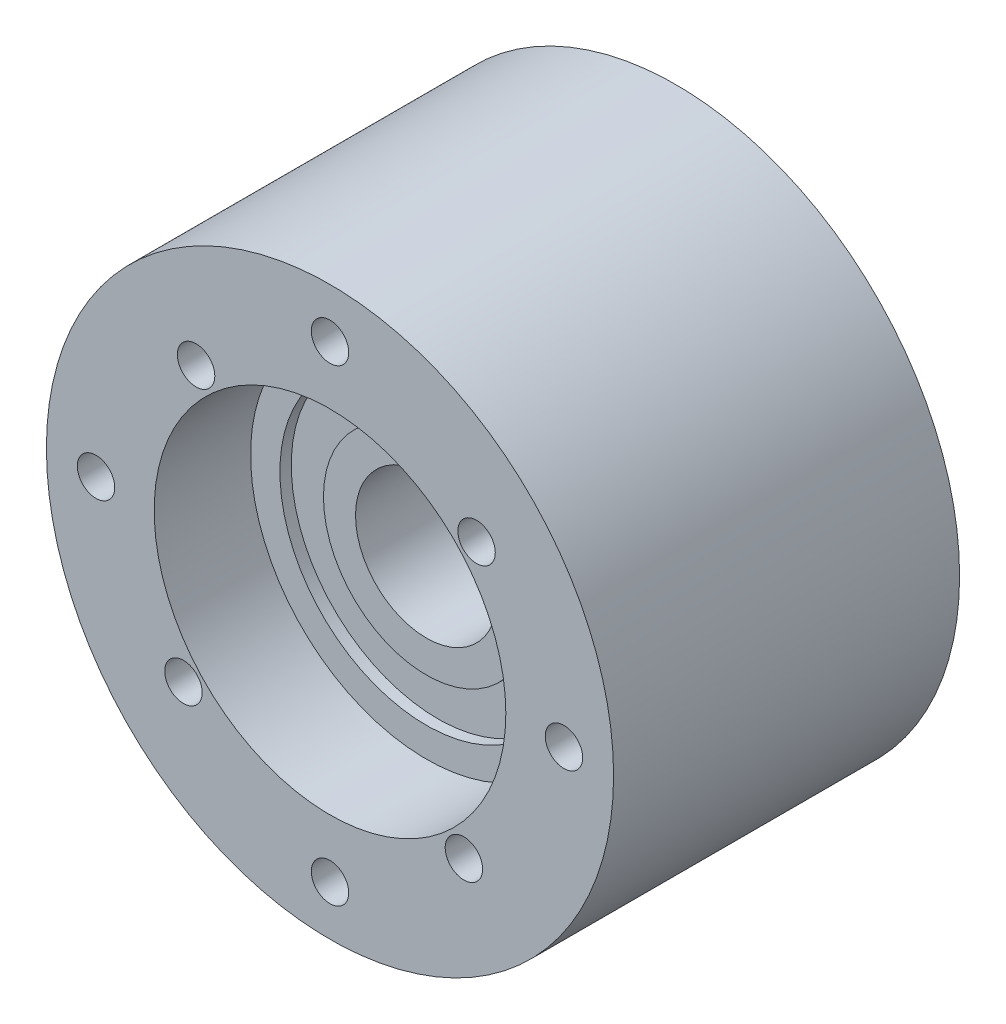
ISO-10303-21;
HEADER;
FILE_DESCRIPTION(('STEP AP214'),'2;1');
FILE_NAME('part.step','',(''),(''),'','','');
FILE_SCHEMA(('AUTOMOTIVE_DESIGN { 1 0 10303 214 1 1 1 1 }'));
ENDSEC;
DATA;
#1=APPLICATION_CONTEXT('core data for automotive mechanical design processes');
#2=APPLICATION_PROTOCOL_DEFINITION('international standard','automotive_design',2000,#1);
#3=PRODUCT_CONTEXT('',#1,'mechanical');
#4=PRODUCT('Part','Part','',(#3));
#5=PRODUCT_RELATED_PRODUCT_CATEGORY('part','',(#4));
#6=PRODUCT_DEFINITION_FORMATION('','',#4);
#7=PRODUCT_DEFINITION_CONTEXT('part definition',#1,'design');
#8=PRODUCT_DEFINITION('design','',#6,#7);
#9=PRODUCT_DEFINITION_SHAPE('','',#8);
#10=(LENGTH_UNIT() NAMED_UNIT(*) SI_UNIT(.MILLI.,.METRE.));
#11=(NAMED_UNIT(*) PLANE_ANGLE_UNIT() SI_UNIT($,.RADIAN.));
#12=(NAMED_UNIT(*) SI_UNIT($,.STERADIAN.) SOLID_ANGLE_UNIT());
#13=UNCERTAINTY_MEASURE_WITH_UNIT(LENGTH_MEASURE(1.E-05),#10,'distance_accuracy_value','');
#14=(GEOMETRIC_REPRESENTATION_CONTEXT(3) GLOBAL_UNCERTAINTY_ASSIGNED_CONTEXT((#13)) GLOBAL_UNIT_ASSIGNED_CONTEXT((#10,
#11,#12)) REPRESENTATION_CONTEXT('',''));
#15=CARTESIAN_POINT('',(0.,0.,0.));
#16=DIRECTION('',(0.,0.,1.));
#17=DIRECTION('',(1.,0.,0.));
#18=AXIS2_PLACEMENT_3D('',#15,#16,#17);
#19=CARTESIAN_POINT('',(0.,0.,44.));
#20=DIRECTION('',(0.,0.,1.));
#21=DIRECTION('',(1.,0.,0.));
#22=AXIS2_PLACEMENT_3D('',#19,#20,#21);
#23=PLANE('',#22);
#24=CARTESIAN_POINT('',(0.,0.,44.));
#25=DIRECTION('',(0.,0.,1.));
#26=DIRECTION('',(1.,0.,0.));
#27=AXIS2_PLACEMENT_3D('',#24,#25,#26);
#28=CIRCLE('',#27,12.5);
#29=CARTESIAN_POINT('',(12.5,0.,44.));
#30=VERTEX_POINT('',#29);
#31=EDGE_CURVE('E39',#30,#30,#28,.F.);
#32=ORIENTED_EDGE('',*,*,#31,.T.);
#33=EDGE_LOOP('',(#32));
#34=FACE_BOUND('',#33,.T.);
#35=CARTESIAN_POINT('',(0.,0.,44.));
#36=DIRECTION('',(0.,0.,1.));
#37=DIRECTION('',(1.,0.,0.));
#38=AXIS2_PLACEMENT_3D('',#35,#36,#37);
#39=CIRCLE('',#38,18.1537734431174);
#40=CARTESIAN_POINT('',(18.1537734431174,0.,44.));
#41=VERTEX_POINT('',#40);
#42=EDGE_CURVE('E91',#41,#41,#39,.T.);
#43=ORIENTED_EDGE('',*,*,#42,.T.);
#44=EDGE_LOOP('',(#43));
#45=FACE_BOUND('',#44,.T.);
#46=ADVANCED_FACE('F35',(#34,#45),#23,.T.);
#47=CARTESIAN_POINT('',(0.,0.,61.));
#48=DIRECTION('',(0.,0.,-1.));
#49=DIRECTION('',(-1.,0.,0.));
#50=AXIS2_PLACEMENT_3D('',#47,#48,#49);
#51=CYLINDRICAL_SURFACE('',#50,12.5);
#52=CARTESIAN_POINT('',(0.,0.,26.));
#53=DIRECTION('',(0.,0.,-1.));
#54=DIRECTION('',(-1.,0.,0.));
#55=AXIS2_PLACEMENT_3D('',#52,#53,#54);
#56=CIRCLE('',#55,12.5);
#57=CARTESIAN_POINT('',(-12.5,0.,26.));
#58=VERTEX_POINT('',#57);
#59=EDGE_CURVE('E157',#58,#58,#56,.T.);
#60=ORIENTED_EDGE('',*,*,#59,.T.);
#61=EDGE_LOOP('',(#60));
#62=FACE_BOUND('',#61,.T.);
#63=ORIENTED_EDGE('',*,*,#31,.F.);
#64=EDGE_LOOP('',(#63));
#65=FACE_BOUND('',#64,.T.);
#66=ADVANCED_FACE('F192',(#62,#65),#51,.F.);
#67=CARTESIAN_POINT('',(0.,0.,61.));
#68=DIRECTION('',(0.,0.,-1.));
#69=DIRECTION('',(-1.,0.,0.));
#70=AXIS2_PLACEMENT_3D('',#67,#68,#69);
#71=CYLINDRICAL_SURFACE('',#70,50.);
#72=CARTESIAN_POINT('',(0.,0.,61.));
#73=DIRECTION('',(0.,0.,1.));
#74=DIRECTION('',(1.,0.,0.));
#75=AXIS2_PLACEMENT_3D('',#72,#73,#74);
#76=CIRCLE('',#75,50.);
#77=CARTESIAN_POINT('',(-50.,0.,61.));
#78=VERTEX_POINT('',#77);
#79=EDGE_CURVE('E11',#78,#78,#76,.T.);
#80=CARTESIAN_POINT('',(0.,0.,0.));
#81=DIRECTION('',(0.,0.,1.));
#82=DIRECTION('',(1.,0.,0.));
#83=AXIS2_PLACEMENT_3D('',#80,#81,#82);
#84=CIRCLE('',#83,50.);
#85=CARTESIAN_POINT('',(-50.,0.,0.));
#86=VERTEX_POINT('',#85);
#87=EDGE_CURVE('E44',#86,#86,#84,.T.);
#88=CARTESIAN_POINT('',(-50.,0.,61.));
#89=CARTESIAN_POINT('',(-50.,0.,60.3645833333333));
#90=CARTESIAN_POINT('',(-50.,0.,59.7291666666667));
#91=CARTESIAN_POINT('',(-50.,0.,58.4583333333333));
#92=CARTESIAN_POINT('',(-50.,0.,57.8229166666667));
#93=CARTESIAN_POINT('',(-50.,0.,56.5520833333333));
#94=CARTESIAN_POINT('',(-50.,0.,55.9166666666667));
#95=CARTESIAN_POINT('',(-50.,0.,54.6458333333333));
#96=CARTESIAN_POINT('',(-50.,0.,54.0104166666667));
#97=CARTESIAN_POINT('',(-50.,0.,52.7395833333333));
#98=CARTESIAN_POINT('',(-50.,0.,52.1041666666667));
#99=CARTESIAN_POINT('',(-50.,0.,50.8333333333333));
#100=CARTESIAN_POINT('',(-50.,0.,50.1979166666667));
#101=CARTESIAN_POINT('',(-50.,0.,48.9270833333333));
#102=CARTESIAN_POINT('',(-50.,0.,48.2916666666667));
#103=CARTESIAN_POINT('',(-50.,0.,47.0208333333333));
#104=CARTESIAN_POINT('',(-50.,0.,46.3854166666667));
#105=CARTESIAN_POINT('',(-50.,0.,45.1145833333333));
#106=CARTESIAN_POINT('',(-50.,0.,44.4791666666667));
#107=CARTESIAN_POINT('',(-50.,0.,43.2083333333333));
#108=CARTESIAN_POINT('',(-50.,0.,42.5729166666667));
#109=CARTESIAN_POINT('',(-50.,0.,41.3020833333333));
#110=CARTESIAN_POINT('',(-50.,0.,40.6666666666667));
#111=CARTESIAN_POINT('',(-50.,0.,39.3958333333333));
#112=CARTESIAN_POINT('',(-50.,0.,38.7604166666667));
#113=CARTESIAN_POINT('',(-50.,0.,37.4895833333333));
#114=CARTESIAN_POINT('',(-50.,0.,36.8541666666667));
#115=CARTESIAN_POINT('',(-50.,0.,35.5833333333333));
#116=CARTESIAN_POINT('',(-50.,0.,34.9479166666667));
#117=CARTESIAN_POINT('',(-50.,0.,33.6770833333333));
#118=CARTESIAN_POINT('',(-50.,0.,33.0416666666667));
#119=CARTESIAN_POINT('',(-50.,0.,31.7708333333333));
#120=CARTESIAN_POINT('',(-50.,0.,31.1354166666667));
#121=CARTESIAN_POINT('',(-50.,0.,29.8645833333333));
#122=CARTESIAN_POINT('',(-50.,0.,29.2291666666667));
#123=CARTESIAN_POINT('',(-50.,0.,27.9583333333333));
#124=CARTESIAN_POINT('',(-50.,0.,27.3229166666667));
#125=CARTESIAN_POINT('',(-50.,0.,26.0520833333333));
#126=CARTESIAN_POINT('',(-50.,0.,25.4166666666667));
#127=CARTESIAN_POINT('',(-50.,0.,24.1458333333333));
#128=CARTESIAN_POINT('',(-50.,0.,23.5104166666667));
#129=CARTESIAN_POINT('',(-50.,0.,22.2395833333333));
#130=CARTESIAN_POINT('',(-50.,0.,21.6041666666667));
#131=CARTESIAN_POINT('',(-50.,0.,20.3333333333333));
#132=CARTESIAN_POINT('',(-50.,0.,19.6979166666667));
#133=CARTESIAN_POINT('',(-50.,0.,18.4270833333333));
#134=CARTESIAN_POINT('',(-50.,0.,17.7916666666667));
#135=CARTESIAN_POINT('',(-50.,0.,16.5208333333333));
#136=CARTESIAN_POINT('',(-50.,0.,15.8854166666667));
#137=CARTESIAN_POINT('',(-50.,0.,14.6145833333333));
#138=CARTESIAN_POINT('',(-50.,0.,13.9791666666667));
#139=CARTESIAN_POINT('',(-50.,0.,12.7083333333333));
#140=CARTESIAN_POINT('',(-50.,0.,12.0729166666667));
#141=CARTESIAN_POINT('',(-50.,0.,10.8020833333333));
#142=CARTESIAN_POINT('',(-50.,0.,10.1666666666667));
#143=CARTESIAN_POINT('',(-50.,0.,8.89583333333333));
#144=CARTESIAN_POINT('',(-50.,0.,8.26041666666666));
#145=CARTESIAN_POINT('',(-50.,0.,6.98958333333333));
#146=CARTESIAN_POINT('',(-50.,0.,6.35416666666666));
#147=CARTESIAN_POINT('',(-50.,0.,5.08333333333333));
#148=CARTESIAN_POINT('',(-50.,0.,4.44791666666666));
#149=CARTESIAN_POINT('',(-50.,0.,3.17708333333333));
#150=CARTESIAN_POINT('',(-50.,0.,2.54166666666666));
#151=CARTESIAN_POINT('',(-50.,0.,1.27083333333332));
#152=CARTESIAN_POINT('',(-50.,0.,0.635416666666658));
#153=CARTESIAN_POINT('',(-50.,0.,0.));
#154=B_SPLINE_CURVE_WITH_KNOTS('',3,(#88,#89,#90,#91,#92,#93,#94,#95,#96,#97,#98,#99,#100,#101,
#102,#103,#104,#105,#106,#107,#108,#109,#110,#111,#112,#113,#114,#115,#116,#117,#118,#119,#120,
#121,#122,#123,#124,#125,#126,#127,#128,#129,#130,#131,#132,#133,#134,#135,#136,#137,#138,#139,
#140,#141,#142,#143,#144,#145,#146,#147,#148,#149,#150,#151,#152,#153),.UNSPECIFIED.,.F.,.F.,(4,
2,2,2,2,2,2,2,2,2,2,2,2,2,2,2,2,2,2,2,2,2,2,2,2,2,2,2,2,2,2,2,4),(0.,1.90625000000001,3.8125,
5.71875,7.62500000000001,9.53125000000001,11.4375,13.34375,15.25,17.15625,19.0625,20.96875,
22.875,24.78125,26.6875,28.59375,30.5,32.40625,34.3125,36.21875,38.125,40.03125,41.9375,
43.84375,45.75,47.65625,49.5625,51.46875,53.375,55.28125,57.1875,59.09375,61.),.UNSPECIFIED.);
#155=EDGE_CURVE('BSEAM37',#78,#86,#154,.T.);
#156=ORIENTED_EDGE('',*,*,#79,.F.);
#157=ORIENTED_EDGE('',*,*,#87,.T.);
#158=ORIENTED_EDGE('',*,*,#155,.T.);
#159=ORIENTED_EDGE('',*,*,#155,.F.);
#160=EDGE_LOOP('',(#156,#158,#157,#159));
#161=FACE_BOUND('',#160,.T.);
#162=ADVANCED_FACE('F37',(#161),#71,.T.);
#163=CARTESIAN_POINT('',(0.,0.,61.));
#164=DIRECTION('',(0.,0.,1.));
#165=DIRECTION('',(1.,0.,0.));
#166=AXIS2_PLACEMENT_3D('',#163,#164,#165);
#167=PLANE('',#166);
#168=CARTESIAN_POINT('',(-23.6085930044774,25.8386210225883,61.));
#169=DIRECTION('',(0.,0.,1.));
#170=DIRECTION('',(1.,0.,0.));
#171=AXIS2_PLACEMENT_3D('',#168,#169,#170);
#172=CIRCLE('',#171,3.29999999999999);
#173=CARTESIAN_POINT('',(-20.3085930044774,25.8386210225883,61.));
#174=VERTEX_POINT('',#173);
#175=EDGE_CURVE('E69',#174,#174,#172,.T.);
#176=ORIENTED_EDGE('',*,*,#175,.F.);
#177=EDGE_LOOP('',(#176));
#178=FACE_BOUND('',#177,.T.);
#179=CARTESIAN_POINT('',(-25.8386210225883,-23.6085930044774,61.));
#180=DIRECTION('',(0.,0.,1.));
#181=DIRECTION('',(1.,0.,0.));
#182=AXIS2_PLACEMENT_3D('',#179,#180,#181);
#183=CIRCLE('',#182,3.29999999999999);
#184=CARTESIAN_POINT('',(-22.5386210225883,-23.6085930044774,61.));
#185=VERTEX_POINT('',#184);
#186=EDGE_CURVE('E68',#185,#185,#183,.T.);
#187=ORIENTED_EDGE('',*,*,#186,.F.);
#188=EDGE_LOOP('',(#187));
#189=FACE_BOUND('',#188,.T.);
#190=CARTESIAN_POINT('',(23.6085930044774,-25.8386210225883,61.));
#191=DIRECTION('',(0.,0.,1.));
#192=DIRECTION('',(1.,0.,0.));
#193=AXIS2_PLACEMENT_3D('',#190,#191,#192);
#194=CIRCLE('',#193,3.29999999999999);
#195=CARTESIAN_POINT('',(26.9085930044774,-25.8386210225883,61.));
#196=VERTEX_POINT('',#195);
#197=EDGE_CURVE('E79',#196,#196,#194,.T.);
#198=ORIENTED_EDGE('',*,*,#197,.F.);
#199=EDGE_LOOP('',(#198));
#200=FACE_BOUND('',#199,.T.);
#201=CARTESIAN_POINT('',(25.8386210225883,23.6085930044774,61.));
#202=DIRECTION('',(0.,0.,1.));
#203=DIRECTION('',(1.,0.,0.));
#204=AXIS2_PLACEMENT_3D('',#201,#202,#203);
#205=CIRCLE('',#204,3.29999999999999);
#206=CARTESIAN_POINT('',(29.1386210225883,23.6085930044774,61.));
#207=VERTEX_POINT('',#206);
#208=EDGE_CURVE('E85',#207,#207,#205,.T.);
#209=ORIENTED_EDGE('',*,*,#208,.F.);
#210=EDGE_LOOP('',(#209));
#211=FACE_BOUND('',#210,.T.);
#212=CARTESIAN_POINT('',(0.,0.,61.));
#213=DIRECTION('',(0.,0.,1.));
#214=DIRECTION('',(1.,0.,0.));
#215=AXIS2_PLACEMENT_3D('',#212,#213,#214);
#216=CIRCLE('',#215,31.);
#217=CARTESIAN_POINT('',(31.,0.,61.));
#218=VERTEX_POINT('',#217);
#219=EDGE_CURVE('E101',#218,#218,#216,.T.);
#220=ORIENTED_EDGE('',*,*,#219,.F.);
#221=EDGE_LOOP('',(#220));
#222=FACE_BOUND('',#221,.T.);
#223=CARTESIAN_POINT('',(-41.25,0.,61.));
#224=DIRECTION('',(0.,0.,-1.));
#225=DIRECTION('',(-1.,0.,0.));
#226=AXIS2_PLACEMENT_3D('',#223,#224,#225);
#227=CIRCLE('',#226,3.29999999999998);
#228=CARTESIAN_POINT('',(-44.55,0.,61.));
#229=VERTEX_POINT('',#228);
#230=EDGE_CURVE('E118',#229,#229,#227,.T.);
#231=ORIENTED_EDGE('',*,*,#230,.T.);
#232=EDGE_LOOP('',(#231));
#233=FACE_BOUND('',#232,.T.);
#234=CARTESIAN_POINT('',(0.,41.25,61.));
#235=DIRECTION('',(0.,0.,-1.));
#236=DIRECTION('',(-1.,0.,0.));
#237=AXIS2_PLACEMENT_3D('',#234,#235,#236);
#238=CIRCLE('',#237,3.29999999999998);
#239=CARTESIAN_POINT('',(-3.29999999999998,41.25,61.));
#240=VERTEX_POINT('',#239);
#241=EDGE_CURVE('E130',#240,#240,#238,.T.);
#242=ORIENTED_EDGE('',*,*,#241,.T.);
#243=EDGE_LOOP('',(#242));
#244=FACE_BOUND('',#243,.T.);
#245=CARTESIAN_POINT('',(41.25,0.,61.));
#246=DIRECTION('',(0.,0.,-1.));
#247=DIRECTION('',(-1.,0.,0.));
#248=AXIS2_PLACEMENT_3D('',#245,#246,#247);
#249=CIRCLE('',#248,3.29999999999998);
#250=CARTESIAN_POINT('',(37.95,0.,61.));
#251=VERTEX_POINT('',#250);
#252=EDGE_CURVE('E142',#251,#251,#249,.T.);
#253=ORIENTED_EDGE('',*,*,#252,.T.);
#254=EDGE_LOOP('',(#253));
#255=FACE_BOUND('',#254,.T.);
#256=CARTESIAN_POINT('',(0.,-41.25,61.));
#257=DIRECTION('',(0.,0.,-1.));
#258=DIRECTION('',(-1.,0.,0.));
#259=AXIS2_PLACEMENT_3D('',#256,#257,#258);
#260=CIRCLE('',#259,3.29999999999998);
#261=CARTESIAN_POINT('',(-3.29999999999998,-41.25,61.));
#262=VERTEX_POINT('',#261);
#263=EDGE_CURVE('E154',#262,#262,#260,.T.);
#264=ORIENTED_EDGE('',*,*,#263,.T.);
#265=EDGE_LOOP('',(#264));
#266=FACE_BOUND('',#265,.T.);
#267=ORIENTED_EDGE('',*,*,#79,.T.);
#268=EDGE_LOOP('',(#267));
#269=FACE_BOUND('',#268,.T.);
#270=ADVANCED_FACE('F178',(#178,#189,#200,#211,#222,#233,#244,#255,#266,#269),#167,.T.);
#271=CARTESIAN_POINT('',(0.,0.,0.));
#272=DIRECTION('',(0.,0.,1.));
#273=DIRECTION('',(1.,0.,0.));
#274=AXIS2_PLACEMENT_3D('',#271,#272,#273);
#275=PLANE('',#274);
#276=CARTESIAN_POINT('',(-41.25,0.,0.));
#277=DIRECTION('',(0.,0.,-1.));
#278=DIRECTION('',(-1.,0.,0.));
#279=AXIS2_PLACEMENT_3D('',#276,#277,#278);
#280=CIRCLE('',#279,6.5);
#281=CARTESIAN_POINT('',(-47.75,0.,0.));
#282=VERTEX_POINT('',#281);
#283=EDGE_CURVE('E109',#282,#282,#280,.T.);
#284=ORIENTED_EDGE('',*,*,#283,.F.);
#285=EDGE_LOOP('',(#284));
#286=FACE_BOUND('',#285,.T.);
#287=CARTESIAN_POINT('',(0.,41.25,0.));
#288=DIRECTION('',(0.,0.,-1.));
#289=DIRECTION('',(-1.,0.,0.));
#290=AXIS2_PLACEMENT_3D('',#287,#288,#289);
#291=CIRCLE('',#290,6.5);
#292=CARTESIAN_POINT('',(-6.5,41.25,0.));
#293=VERTEX_POINT('',#292);
#294=EDGE_CURVE('E121',#293,#293,#291,.T.);
#295=ORIENTED_EDGE('',*,*,#294,.F.);
#296=EDGE_LOOP('',(#295));
#297=FACE_BOUND('',#296,.T.);
#298=CARTESIAN_POINT('',(41.25,0.,0.));
#299=DIRECTION('',(0.,0.,-1.));
#300=DIRECTION('',(-1.,0.,0.));
#301=AXIS2_PLACEMENT_3D('',#298,#299,#300);
#302=CIRCLE('',#301,6.5);
#303=CARTESIAN_POINT('',(34.75,0.,0.));
#304=VERTEX_POINT('',#303);
#305=EDGE_CURVE('E133',#304,#304,#302,.T.);
#306=ORIENTED_EDGE('',*,*,#305,.F.);
#307=EDGE_LOOP('',(#306));
#308=FACE_BOUND('',#307,.T.);
#309=CARTESIAN_POINT('',(0.,-41.25,0.));
#310=DIRECTION('',(0.,0.,-1.));
#311=DIRECTION('',(-1.,0.,0.));
#312=AXIS2_PLACEMENT_3D('',#309,#310,#311);
#313=CIRCLE('',#312,6.5);
#314=CARTESIAN_POINT('',(-6.5,-41.25,0.));
#315=VERTEX_POINT('',#314);
#316=EDGE_CURVE('E145',#315,#315,#313,.T.);
#317=ORIENTED_EDGE('',*,*,#316,.F.);
#318=EDGE_LOOP('',(#317));
#319=FACE_BOUND('',#318,.T.);
#320=CARTESIAN_POINT('',(0.,0.,0.));
#321=DIRECTION('',(0.,0.,-1.));
#322=DIRECTION('',(-1.,0.,0.));
#323=AXIS2_PLACEMENT_3D('',#320,#321,#322);
#324=CIRCLE('',#323,32.5);
#325=CARTESIAN_POINT('',(-32.5,0.,0.));
#326=VERTEX_POINT('',#325);
#327=EDGE_CURVE('E164',#326,#326,#324,.T.);
#328=ORIENTED_EDGE('',*,*,#327,.F.);
#329=EDGE_LOOP('',(#328));
#330=FACE_BOUND('',#329,.T.);
#331=ORIENTED_EDGE('',*,*,#87,.F.);
#332=EDGE_LOOP('',(#331));
#333=FACE_BOUND('',#332,.T.);
#334=ADVANCED_FACE('F175',(#286,#297,#308,#319,#330,#333),#275,.F.);
#335=CARTESIAN_POINT('',(0.,0.,19.));
#336=DIRECTION('',(0.,0.,-1.));
#337=DIRECTION('',(-1.,0.,0.));
#338=AXIS2_PLACEMENT_3D('',#335,#336,#337);
#339=CYLINDRICAL_SURFACE('',#338,32.5);
#340=CARTESIAN_POINT('',(0.,0.,19.));
#341=DIRECTION('',(0.,0.,-1.));
#342=DIRECTION('',(-1.,0.,0.));
#343=AXIS2_PLACEMENT_3D('',#340,#341,#342);
#344=CIRCLE('',#343,32.5);
#345=CARTESIAN_POINT('',(-32.5,0.,19.));
#346=VERTEX_POINT('',#345);
#347=EDGE_CURVE('E167',#346,#346,#344,.T.);
#348=ORIENTED_EDGE('',*,*,#347,.F.);
#349=EDGE_LOOP('',(#348));
#350=FACE_BOUND('',#349,.T.);
#351=ORIENTED_EDGE('',*,*,#327,.T.);
#352=EDGE_LOOP('',(#351));
#353=FACE_BOUND('',#352,.T.);
#354=ADVANCED_FACE('F177',(#350,#353),#339,.F.);
#355=CARTESIAN_POINT('',(0.,0.,19.));
#356=DIRECTION('',(0.,0.,-1.));
#357=DIRECTION('',(-1.,0.,0.));
#358=AXIS2_PLACEMENT_3D('',#355,#356,#357);
#359=PLANE('',#358);
#360=CARTESIAN_POINT('',(0.,0.,19.));
#361=DIRECTION('',(0.,0.,-1.));
#362=DIRECTION('',(-1.,0.,0.));
#363=AXIS2_PLACEMENT_3D('',#360,#361,#362);
#364=CIRCLE('',#363,30.);
#365=CARTESIAN_POINT('',(-30.,0.,19.));
#366=VERTEX_POINT('',#365);
#367=EDGE_CURVE('E160',#366,#366,#364,.T.);
#368=ORIENTED_EDGE('',*,*,#367,.F.);
#369=EDGE_LOOP('',(#368));
#370=FACE_BOUND('',#369,.T.);
#371=ORIENTED_EDGE('',*,*,#347,.T.);
#372=EDGE_LOOP('',(#371));
#373=FACE_BOUND('',#372,.T.);
#374=ADVANCED_FACE('F184',(#370,#373),#359,.T.);
#375=CARTESIAN_POINT('',(0.,0.,26.));
#376=DIRECTION('',(0.,0.,-1.));
#377=DIRECTION('',(-1.,0.,0.));
#378=AXIS2_PLACEMENT_3D('',#375,#376,#377);
#379=CYLINDRICAL_SURFACE('',#378,30.);
#380=CARTESIAN_POINT('',(0.,0.,26.));
#381=DIRECTION('',(0.,0.,-1.));
#382=DIRECTION('',(-1.,0.,0.));
#383=AXIS2_PLACEMENT_3D('',#380,#381,#382);
#384=CIRCLE('',#383,30.);
#385=CARTESIAN_POINT('',(-30.,0.,26.));
#386=VERTEX_POINT('',#385);
#387=EDGE_CURVE('E161',#386,#386,#384,.T.);
#388=ORIENTED_EDGE('',*,*,#387,.F.);
#389=EDGE_LOOP('',(#388));
#390=FACE_BOUND('',#389,.T.);
#391=ORIENTED_EDGE('',*,*,#367,.T.);
#392=EDGE_LOOP('',(#391));
#393=FACE_BOUND('',#392,.T.);
#394=ADVANCED_FACE('F481',(#390,#393),#379,.F.);
#395=CARTESIAN_POINT('',(0.,0.,26.));
#396=DIRECTION('',(0.,0.,-1.));
#397=DIRECTION('',(-1.,0.,0.));
#398=AXIS2_PLACEMENT_3D('',#395,#396,#397);
#399=PLANE('',#398);
#400=ORIENTED_EDGE('',*,*,#59,.F.);
#401=EDGE_LOOP('',(#400));
#402=FACE_BOUND('',#401,.T.);
#403=ORIENTED_EDGE('',*,*,#387,.T.);
#404=EDGE_LOOP('',(#403));
#405=FACE_BOUND('',#404,.T.);
#406=ADVANCED_FACE('F472',(#402,#405),#399,.T.);
#407=CARTESIAN_POINT('',(0.,-41.25,0.));
#408=DIRECTION('',(0.,0.,-1.));
#409=DIRECTION('',(-1.,0.,0.));
#410=AXIS2_PLACEMENT_3D('',#407,#408,#409);
#411=CYLINDRICAL_SURFACE('',#410,3.29999999999999);
#412=ORIENTED_EDGE('',*,*,#263,.F.);
#413=EDGE_LOOP('',(#412));
#414=FACE_BOUND('',#413,.T.);
#415=CARTESIAN_POINT('',(0.,-41.25,4.6));
#416=DIRECTION('',(0.,0.,-1.));
#417=DIRECTION('',(-1.,0.,0.));
#418=AXIS2_PLACEMENT_3D('',#415,#416,#417);
#419=CIRCLE('',#418,3.3);
#420=CARTESIAN_POINT('',(-3.3,-41.25,4.6));
#421=VERTEX_POINT('',#420);
#422=EDGE_CURVE('E151',#421,#421,#419,.T.);
#423=ORIENTED_EDGE('',*,*,#422,.T.);
#424=EDGE_LOOP('',(#423));
#425=FACE_BOUND('',#424,.T.);
#426=ADVANCED_FACE('F463',(#414,#425),#411,.F.);
#427=CARTESIAN_POINT('',(3.3,-41.25,4.6));
#428=DIRECTION('',(0.,0.,1.));
#429=DIRECTION('',(1.,0.,0.));
#430=AXIS2_PLACEMENT_3D('',#427,#428,#429);
#431=PLANE('',#430);
#432=ORIENTED_EDGE('',*,*,#422,.F.);
#433=EDGE_LOOP('',(#432));
#434=FACE_BOUND('',#433,.T.);
#435=CARTESIAN_POINT('',(0.,-41.25,4.6));
#436=DIRECTION('',(0.,0.,-1.));
#437=DIRECTION('',(-1.,0.,0.));
#438=AXIS2_PLACEMENT_3D('',#435,#436,#437);
#439=CIRCLE('',#438,6.5);
#440=CARTESIAN_POINT('',(-6.5,-41.25,4.6));
#441=VERTEX_POINT('',#440);
#442=EDGE_CURVE('E148',#441,#441,#439,.T.);
#443=ORIENTED_EDGE('',*,*,#442,.T.);
#444=EDGE_LOOP('',(#443));
#445=FACE_BOUND('',#444,.T.);
#446=ADVANCED_FACE('F454',(#434,#445),#431,.F.);
#447=CARTESIAN_POINT('',(0.,-41.25,0.));
#448=DIRECTION('',(0.,0.,-1.));
#449=DIRECTION('',(-1.,0.,0.));
#450=AXIS2_PLACEMENT_3D('',#447,#448,#449);
#451=CYLINDRICAL_SURFACE('',#450,6.5);
#452=ORIENTED_EDGE('',*,*,#442,.F.);
#453=EDGE_LOOP('',(#452));
#454=FACE_BOUND('',#453,.T.);
#455=ORIENTED_EDGE('',*,*,#316,.T.);
#456=EDGE_LOOP('',(#455));
#457=FACE_BOUND('',#456,.T.);
#458=ADVANCED_FACE('F445',(#454,#457),#451,.F.);
#459=CARTESIAN_POINT('',(41.25,0.,0.));
#460=DIRECTION('',(0.,0.,-1.));
#461=DIRECTION('',(-1.,0.,0.));
#462=AXIS2_PLACEMENT_3D('',#459,#460,#461);
#463=CYLINDRICAL_SURFACE('',#462,3.29999999999999);
#464=ORIENTED_EDGE('',*,*,#252,.F.);
#465=EDGE_LOOP('',(#464));
#466=FACE_BOUND('',#465,.T.);
#467=CARTESIAN_POINT('',(41.25,0.,4.6));
#468=DIRECTION('',(0.,0.,-1.));
#469=DIRECTION('',(-1.,0.,0.));
#470=AXIS2_PLACEMENT_3D('',#467,#468,#469);
#471=CIRCLE('',#470,3.3);
#472=CARTESIAN_POINT('',(37.95,0.,4.6));
#473=VERTEX_POINT('',#472);
#474=EDGE_CURVE('E139',#473,#473,#471,.T.);
#475=ORIENTED_EDGE('',*,*,#474,.T.);
#476=EDGE_LOOP('',(#475));
#477=FACE_BOUND('',#476,.T.);
#478=ADVANCED_FACE('F436',(#466,#477),#463,.F.);
#479=CARTESIAN_POINT('',(44.55,0.,4.6));
#480=DIRECTION('',(0.,0.,1.));
#481=DIRECTION('',(1.,0.,0.));
#482=AXIS2_PLACEMENT_3D('',#479,#480,#481);
#483=PLANE('',#482);
#484=ORIENTED_EDGE('',*,*,#474,.F.);
#485=EDGE_LOOP('',(#484));
#486=FACE_BOUND('',#485,.T.);
#487=CARTESIAN_POINT('',(41.25,0.,4.6));
#488=DIRECTION('',(0.,0.,-1.));
#489=DIRECTION('',(-1.,0.,0.));
#490=AXIS2_PLACEMENT_3D('',#487,#488,#489);
#491=CIRCLE('',#490,6.5);
#492=CARTESIAN_POINT('',(34.75,0.,4.6));
#493=VERTEX_POINT('',#492);
#494=EDGE_CURVE('E136',#493,#493,#491,.T.);
#495=ORIENTED_EDGE('',*,*,#494,.T.);
#496=EDGE_LOOP('',(#495));
#497=FACE_BOUND('',#496,.T.);
#498=ADVANCED_FACE('F427',(#486,#497),#483,.F.);
#499=CARTESIAN_POINT('',(41.25,0.,0.));
#500=DIRECTION('',(0.,0.,-1.));
#501=DIRECTION('',(-1.,0.,0.));
#502=AXIS2_PLACEMENT_3D('',#499,#500,#501);
#503=CYLINDRICAL_SURFACE('',#502,6.5);
#504=ORIENTED_EDGE('',*,*,#494,.F.);
#505=EDGE_LOOP('',(#504));
#506=FACE_BOUND('',#505,.T.);
#507=ORIENTED_EDGE('',*,*,#305,.T.);
#508=EDGE_LOOP('',(#507));
#509=FACE_BOUND('',#508,.T.);
#510=ADVANCED_FACE('F418',(#506,#509),#503,.F.);
#511=CARTESIAN_POINT('',(0.,41.25,0.));
#512=DIRECTION('',(0.,0.,-1.));
#513=DIRECTION('',(-1.,0.,0.));
#514=AXIS2_PLACEMENT_3D('',#511,#512,#513);
#515=CYLINDRICAL_SURFACE('',#514,3.29999999999999);
#516=ORIENTED_EDGE('',*,*,#241,.F.);
#517=EDGE_LOOP('',(#516));
#518=FACE_BOUND('',#517,.T.);
#519=CARTESIAN_POINT('',(0.,41.25,4.6));
#520=DIRECTION('',(0.,0.,-1.));
#521=DIRECTION('',(-1.,0.,0.));
#522=AXIS2_PLACEMENT_3D('',#519,#520,#521);
#523=CIRCLE('',#522,3.3);
#524=CARTESIAN_POINT('',(-3.3,41.25,4.6));
#525=VERTEX_POINT('',#524);
#526=EDGE_CURVE('E127',#525,#525,#523,.T.);
#527=ORIENTED_EDGE('',*,*,#526,.T.);
#528=EDGE_LOOP('',(#527));
#529=FACE_BOUND('',#528,.T.);
#530=ADVANCED_FACE('F409',(#518,#529),#515,.F.);
#531=CARTESIAN_POINT('',(3.3,41.25,4.6));
#532=DIRECTION('',(0.,0.,1.));
#533=DIRECTION('',(1.,0.,0.));
#534=AXIS2_PLACEMENT_3D('',#531,#532,#533);
#535=PLANE('',#534);
#536=ORIENTED_EDGE('',*,*,#526,.F.);
#537=EDGE_LOOP('',(#536));
#538=FACE_BOUND('',#537,.T.);
#539=CARTESIAN_POINT('',(0.,41.25,4.6));
#540=DIRECTION('',(0.,0.,-1.));
#541=DIRECTION('',(-1.,0.,0.));
#542=AXIS2_PLACEMENT_3D('',#539,#540,#541);
#543=CIRCLE('',#542,6.5);
#544=CARTESIAN_POINT('',(-6.5,41.25,4.6));
#545=VERTEX_POINT('',#544);
#546=EDGE_CURVE('E124',#545,#545,#543,.T.);
#547=ORIENTED_EDGE('',*,*,#546,.T.);
#548=EDGE_LOOP('',(#547));
#549=FACE_BOUND('',#548,.T.);
#550=ADVANCED_FACE('F400',(#538,#549),#535,.F.);
#551=CARTESIAN_POINT('',(0.,41.25,0.));
#552=DIRECTION('',(0.,0.,-1.));
#553=DIRECTION('',(-1.,0.,0.));
#554=AXIS2_PLACEMENT_3D('',#551,#552,#553);
#555=CYLINDRICAL_SURFACE('',#554,6.5);
#556=ORIENTED_EDGE('',*,*,#546,.F.);
#557=EDGE_LOOP('',(#556));
#558=FACE_BOUND('',#557,.T.);
#559=ORIENTED_EDGE('',*,*,#294,.T.);
#560=EDGE_LOOP('',(#559));
#561=FACE_BOUND('',#560,.T.);
#562=ADVANCED_FACE('F391',(#558,#561),#555,.F.);
#563=CARTESIAN_POINT('',(-41.25,0.,0.));
#564=DIRECTION('',(0.,0.,-1.));
#565=DIRECTION('',(-1.,0.,0.));
#566=AXIS2_PLACEMENT_3D('',#563,#564,#565);
#567=CYLINDRICAL_SURFACE('',#566,3.29999999999999);
#568=ORIENTED_EDGE('',*,*,#230,.F.);
#569=EDGE_LOOP('',(#568));
#570=FACE_BOUND('',#569,.T.);
#571=CARTESIAN_POINT('',(-41.25,0.,4.6));
#572=DIRECTION('',(0.,0.,-1.));
#573=DIRECTION('',(-1.,0.,0.));
#574=AXIS2_PLACEMENT_3D('',#571,#572,#573);
#575=CIRCLE('',#574,3.3);
#576=CARTESIAN_POINT('',(-44.55,0.,4.6));
#577=VERTEX_POINT('',#576);
#578=EDGE_CURVE('E115',#577,#577,#575,.T.);
#579=ORIENTED_EDGE('',*,*,#578,.T.);
#580=EDGE_LOOP('',(#579));
#581=FACE_BOUND('',#580,.T.);
#582=ADVANCED_FACE('F382',(#570,#581),#567,.F.);
#583=CARTESIAN_POINT('',(-37.95,0.,4.6));
#584=DIRECTION('',(0.,0.,1.));
#585=DIRECTION('',(1.,0.,0.));
#586=AXIS2_PLACEMENT_3D('',#583,#584,#585);
#587=PLANE('',#586);
#588=ORIENTED_EDGE('',*,*,#578,.F.);
#589=EDGE_LOOP('',(#588));
#590=FACE_BOUND('',#589,.T.);
#591=CARTESIAN_POINT('',(-41.25,0.,4.6));
#592=DIRECTION('',(0.,0.,-1.));
#593=DIRECTION('',(-1.,0.,0.));
#594=AXIS2_PLACEMENT_3D('',#591,#592,#593);
#595=CIRCLE('',#594,6.5);
#596=CARTESIAN_POINT('',(-47.75,0.,4.6));
#597=VERTEX_POINT('',#596);
#598=EDGE_CURVE('E112',#597,#597,#595,.T.);
#599=ORIENTED_EDGE('',*,*,#598,.T.);
#600=EDGE_LOOP('',(#599));
#601=FACE_BOUND('',#600,.T.);
#602=ADVANCED_FACE('F215',(#590,#601),#587,.F.);
#603=CARTESIAN_POINT('',(-41.25,0.,0.));
#604=DIRECTION('',(0.,0.,-1.));
#605=DIRECTION('',(-1.,0.,0.));
#606=AXIS2_PLACEMENT_3D('',#603,#604,#605);
#607=CYLINDRICAL_SURFACE('',#606,6.5);
#608=ORIENTED_EDGE('',*,*,#598,.F.);
#609=EDGE_LOOP('',(#608));
#610=FACE_BOUND('',#609,.T.);
#611=ORIENTED_EDGE('',*,*,#283,.T.);
#612=EDGE_LOOP('',(#611));
#613=FACE_BOUND('',#612,.T.);
#614=ADVANCED_FACE('F207',(#610,#613),#607,.F.);
#615=CARTESIAN_POINT('',(0.,0.,44.));
#616=DIRECTION('',(0.,0.,1.));
#617=DIRECTION('',(1.,0.,0.));
#618=AXIS2_PLACEMENT_3D('',#615,#616,#617);
#619=CIRCLE('',#618,25.8302393315333);
#620=CARTESIAN_POINT('',(25.8302393315333,0.,44.));
#621=VERTEX_POINT('',#620);
#622=EDGE_CURVE('E95',#621,#621,#619,.T.);
#623=ORIENTED_EDGE('',*,*,#622,.F.);
#624=EDGE_LOOP('',(#623));
#625=FACE_BOUND('',#624,.T.);
#626=CARTESIAN_POINT('',(0.,0.,44.));
#627=DIRECTION('',(0.,0.,1.));
#628=DIRECTION('',(1.,0.,0.));
#629=AXIS2_PLACEMENT_3D('',#626,#627,#628);
#630=CIRCLE('',#629,31.);
#631=CARTESIAN_POINT('',(31.,0.,44.));
#632=VERTEX_POINT('',#631);
#633=EDGE_CURVE('E104',#632,#632,#630,.T.);
#634=ORIENTED_EDGE('',*,*,#633,.T.);
#635=EDGE_LOOP('',(#634));
#636=FACE_BOUND('',#635,.T.);
#637=ADVANCED_FACE('F195',(#625,#636),#23,.T.);
#638=CARTESIAN_POINT('',(0.,0.,44.));
#639=DIRECTION('',(0.,0.,1.));
#640=DIRECTION('',(1.,0.,0.));
#641=AXIS2_PLACEMENT_3D('',#638,#639,#640);
#642=CYLINDRICAL_SURFACE('',#641,31.);
#643=ORIENTED_EDGE('',*,*,#633,.F.);
#644=EDGE_LOOP('',(#643));
#645=FACE_BOUND('',#644,.T.);
#646=ORIENTED_EDGE('',*,*,#219,.T.);
#647=EDGE_LOOP('',(#646));
#648=FACE_BOUND('',#647,.T.);
#649=ADVANCED_FACE('F206',(#645,#648),#642,.F.);
#650=CARTESIAN_POINT('',(0.,0.,42.));
#651=DIRECTION('',(0.,0.,1.));
#652=DIRECTION('',(1.,0.,0.));
#653=AXIS2_PLACEMENT_3D('',#650,#651,#652);
#654=CYLINDRICAL_SURFACE('',#653,25.8302393315333);
#655=CARTESIAN_POINT('',(0.,0.,42.));
#656=DIRECTION('',(0.,0.,1.));
#657=DIRECTION('',(1.,0.,0.));
#658=AXIS2_PLACEMENT_3D('',#655,#656,#657);
#659=CIRCLE('',#658,25.8302393315333);
#660=CARTESIAN_POINT('',(25.8302393315333,0.,42.));
#661=VERTEX_POINT('',#660);
#662=EDGE_CURVE('E98',#661,#661,#659,.T.);
#663=ORIENTED_EDGE('',*,*,#662,.F.);
#664=EDGE_LOOP('',(#663));
#665=FACE_BOUND('',#664,.T.);
#666=ORIENTED_EDGE('',*,*,#622,.T.);
#667=EDGE_LOOP('',(#666));
#668=FACE_BOUND('',#667,.T.);
#669=ADVANCED_FACE('F213',(#665,#668),#654,.F.);
#670=CARTESIAN_POINT('',(0.,0.,42.));
#671=DIRECTION('',(0.,0.,1.));
#672=DIRECTION('',(1.,0.,0.));
#673=AXIS2_PLACEMENT_3D('',#670,#671,#672);
#674=PLANE('',#673);
#675=CARTESIAN_POINT('',(0.,0.,42.));
#676=DIRECTION('',(0.,0.,1.));
#677=DIRECTION('',(1.,0.,0.));
#678=AXIS2_PLACEMENT_3D('',#675,#676,#677);
#679=CIRCLE('',#678,18.1537734431174);
#680=CARTESIAN_POINT('',(18.1537734431174,0.,42.));
#681=VERTEX_POINT('',#680);
#682=EDGE_CURVE('E92',#681,#681,#679,.T.);
#683=ORIENTED_EDGE('',*,*,#682,.F.);
#684=EDGE_LOOP('',(#683));
#685=FACE_BOUND('',#684,.T.);
#686=ORIENTED_EDGE('',*,*,#662,.T.);
#687=EDGE_LOOP('',(#686));
#688=FACE_BOUND('',#687,.T.);
#689=ADVANCED_FACE('F330',(#685,#688),#674,.T.);
#690=CARTESIAN_POINT('',(0.,0.,42.));
#691=DIRECTION('',(0.,0.,1.));
#692=DIRECTION('',(1.,0.,0.));
#693=AXIS2_PLACEMENT_3D('',#690,#691,#692);
#694=CYLINDRICAL_SURFACE('',#693,18.1537734431174);
#695=ORIENTED_EDGE('',*,*,#682,.T.);
#696=EDGE_LOOP('',(#695));
#697=FACE_BOUND('',#696,.T.);
#698=ORIENTED_EDGE('',*,*,#42,.F.);
#699=EDGE_LOOP('',(#698));
#700=FACE_BOUND('',#699,.T.);
#701=ADVANCED_FACE('F252',(#697,#700),#694,.T.);
#702=CARTESIAN_POINT('',(25.8386210225883,23.6085930044774,56.));
#703=DIRECTION('',(0.,0.,1.));
#704=DIRECTION('',(1.,0.,0.));
#705=AXIS2_PLACEMENT_3D('',#702,#703,#704);
#706=CONICAL_SURFACE('',#705,3.29999999999999,1.0471975511966);
#707=CARTESIAN_POINT('',(25.8386210225883,23.6085930044774,54.0947441116742));
#708=VERTEX_POINT('',#707);
#709=VERTEX_LOOP('',#708);
#710=FACE_BOUND('',#709,.T.);
#711=CARTESIAN_POINT('',(25.8386210225883,23.6085930044774,56.));
#712=DIRECTION('',(0.,0.,1.));
#713=DIRECTION('',(1.,0.,0.));
#714=AXIS2_PLACEMENT_3D('',#711,#712,#713);
#715=CIRCLE('',#714,3.29999999999999);
#716=CARTESIAN_POINT('',(29.1386210225883,23.6085930044774,56.));
#717=VERTEX_POINT('',#716);
#718=EDGE_CURVE('E88',#717,#717,#715,.T.);
#719=ORIENTED_EDGE('',*,*,#718,.T.);
#720=EDGE_LOOP('',(#719));
#721=FACE_BOUND('',#720,.T.);
#722=ADVANCED_FACE('F257',(#710,#721),#706,.F.);
#723=CARTESIAN_POINT('',(25.8386210225883,23.6085930044774,61.));
#724=DIRECTION('',(0.,0.,1.));
#725=DIRECTION('',(1.,0.,0.));
#726=AXIS2_PLACEMENT_3D('',#723,#724,#725);
#727=CYLINDRICAL_SURFACE('',#726,3.29999999999999);
#728=ORIENTED_EDGE('',*,*,#718,.F.);
#729=EDGE_LOOP('',(#728));
#730=FACE_BOUND('',#729,.T.);
#731=ORIENTED_EDGE('',*,*,#208,.T.);
#732=EDGE_LOOP('',(#731));
#733=FACE_BOUND('',#732,.T.);
#734=ADVANCED_FACE('F262',(#730,#733),#727,.F.);
#735=CARTESIAN_POINT('',(23.6085930044774,-25.8386210225883,56.));
#736=DIRECTION('',(0.,0.,1.));
#737=DIRECTION('',(1.,0.,0.));
#738=AXIS2_PLACEMENT_3D('',#735,#736,#737);
#739=CONICAL_SURFACE('',#738,3.29999999999999,1.0471975511966);
#740=CARTESIAN_POINT('',(23.6085930044774,-25.8386210225883,54.0947441116742));
#741=VERTEX_POINT('',#740);
#742=VERTEX_LOOP('',#741);
#743=FACE_BOUND('',#742,.T.);
#744=CARTESIAN_POINT('',(23.6085930044774,-25.8386210225883,56.));
#745=DIRECTION('',(0.,0.,1.));
#746=DIRECTION('',(1.,0.,0.));
#747=AXIS2_PLACEMENT_3D('',#744,#745,#746);
#748=CIRCLE('',#747,3.29999999999999);
#749=CARTESIAN_POINT('',(26.9085930044774,-25.8386210225883,56.));
#750=VERTEX_POINT('',#749);
#751=EDGE_CURVE('E82',#750,#750,#748,.T.);
#752=ORIENTED_EDGE('',*,*,#751,.T.);
#753=EDGE_LOOP('',(#752));
#754=FACE_BOUND('',#753,.T.);
#755=ADVANCED_FACE('F271',(#743,#754),#739,.F.);
#756=CARTESIAN_POINT('',(23.6085930044774,-25.8386210225883,61.));
#757=DIRECTION('',(0.,0.,1.));
#758=DIRECTION('',(1.,0.,0.));
#759=AXIS2_PLACEMENT_3D('',#756,#757,#758);
#760=CYLINDRICAL_SURFACE('',#759,3.29999999999999);
#761=ORIENTED_EDGE('',*,*,#751,.F.);
#762=EDGE_LOOP('',(#761));
#763=FACE_BOUND('',#762,.T.);
#764=ORIENTED_EDGE('',*,*,#197,.T.);
#765=EDGE_LOOP('',(#764));
#766=FACE_BOUND('',#765,.T.);
#767=ADVANCED_FACE('F281',(#763,#766),#760,.F.);
#768=CARTESIAN_POINT('',(-25.8386210225883,-23.6085930044774,56.));
#769=DIRECTION('',(0.,0.,1.));
#770=DIRECTION('',(1.,0.,0.));
#771=AXIS2_PLACEMENT_3D('',#768,#769,#770);
#772=CONICAL_SURFACE('',#771,3.29999999999999,1.0471975511966);
#773=CARTESIAN_POINT('',(-25.8386210225883,-23.6085930044774,54.0947441116742));
#774=VERTEX_POINT('',#773);
#775=VERTEX_LOOP('',#774);
#776=FACE_BOUND('',#775,.T.);
#777=CARTESIAN_POINT('',(-25.8386210225883,-23.6085930044774,56.));
#778=DIRECTION('',(0.,0.,1.));
#779=DIRECTION('',(1.,0.,0.));
#780=AXIS2_PLACEMENT_3D('',#777,#778,#779);
#781=CIRCLE('',#780,3.29999999999999);
#782=CARTESIAN_POINT('',(-22.5386210225883,-23.6085930044774,56.));
#783=VERTEX_POINT('',#782);
#784=EDGE_CURVE('E72',#783,#783,#781,.T.);
#785=ORIENTED_EDGE('',*,*,#784,.T.);
#786=EDGE_LOOP('',(#785));
#787=FACE_BOUND('',#786,.T.);
#788=ADVANCED_FACE('F290',(#776,#787),#772,.F.);
#789=CARTESIAN_POINT('',(-25.8386210225883,-23.6085930044774,61.));
#790=DIRECTION('',(0.,0.,1.));
#791=DIRECTION('',(1.,0.,0.));
#792=AXIS2_PLACEMENT_3D('',#789,#790,#791);
#793=CYLINDRICAL_SURFACE('',#792,3.29999999999999);
#794=ORIENTED_EDGE('',*,*,#784,.F.);
#795=EDGE_LOOP('',(#794));
#796=FACE_BOUND('',#795,.T.);
#797=ORIENTED_EDGE('',*,*,#186,.T.);
#798=EDGE_LOOP('',(#797));
#799=FACE_BOUND('',#798,.T.);
#800=ADVANCED_FACE('F62',(#796,#799),#793,.F.);
#801=CARTESIAN_POINT('',(-23.6085930044774,25.8386210225883,56.));
#802=DIRECTION('',(0.,0.,1.));
#803=DIRECTION('',(1.,0.,0.));
#804=AXIS2_PLACEMENT_3D('',#801,#802,#803);
#805=CONICAL_SURFACE('',#804,3.29999999999999,1.0471975511966);
#806=CARTESIAN_POINT('',(-23.6085930044774,25.8386210225883,54.0947441116742));
#807=VERTEX_POINT('',#806);
#808=VERTEX_LOOP('',#807);
#809=FACE_BOUND('',#808,.T.);
#810=CARTESIAN_POINT('',(-23.6085930044774,25.8386210225883,56.));
#811=DIRECTION('',(0.,0.,1.));
#812=DIRECTION('',(1.,0.,0.));
#813=AXIS2_PLACEMENT_3D('',#810,#811,#812);
#814=CIRCLE('',#813,3.29999999999999);
#815=CARTESIAN_POINT('',(-20.3085930044774,25.8386210225883,56.));
#816=VERTEX_POINT('',#815);
#817=EDGE_CURVE('E66',#816,#816,#814,.T.);
#818=ORIENTED_EDGE('',*,*,#817,.T.);
#819=EDGE_LOOP('',(#818));
#820=FACE_BOUND('',#819,.T.);
#821=ADVANCED_FACE('F58',(#809,#820),#805,.F.);
#822=CARTESIAN_POINT('',(-23.6085930044774,25.8386210225883,61.));
#823=DIRECTION('',(0.,0.,1.));
#824=DIRECTION('',(1.,0.,0.));
#825=AXIS2_PLACEMENT_3D('',#822,#823,#824);
#826=CYLINDRICAL_SURFACE('',#825,3.29999999999999);
#827=ORIENTED_EDGE('',*,*,#817,.F.);
#828=EDGE_LOOP('',(#827));
#829=FACE_BOUND('',#828,.T.);
#830=ORIENTED_EDGE('',*,*,#175,.T.);
#831=EDGE_LOOP('',(#830));
#832=FACE_BOUND('',#831,.T.);
#833=ADVANCED_FACE('F61',(#829,#832),#826,.F.);
#834=CLOSED_SHELL('',(#46,#66,#162,#270,#334,#354,#374,#394,#406,#426,#446,#458,#478,#498,#510,
#530,#550,#562,#582,#602,#614,#637,#649,#669,#689,#701,#722,#734,#755,#767,#788,#800,#821,#833));
#835=MANIFOLD_SOLID_BREP('B2',#834);
#836=ADVANCED_BREP_SHAPE_REPRESENTATION('',(#18,#835),#14);
#837=SHAPE_DEFINITION_REPRESENTATION(#9,#836);
ENDSEC;
END-ISO-10303-21;
